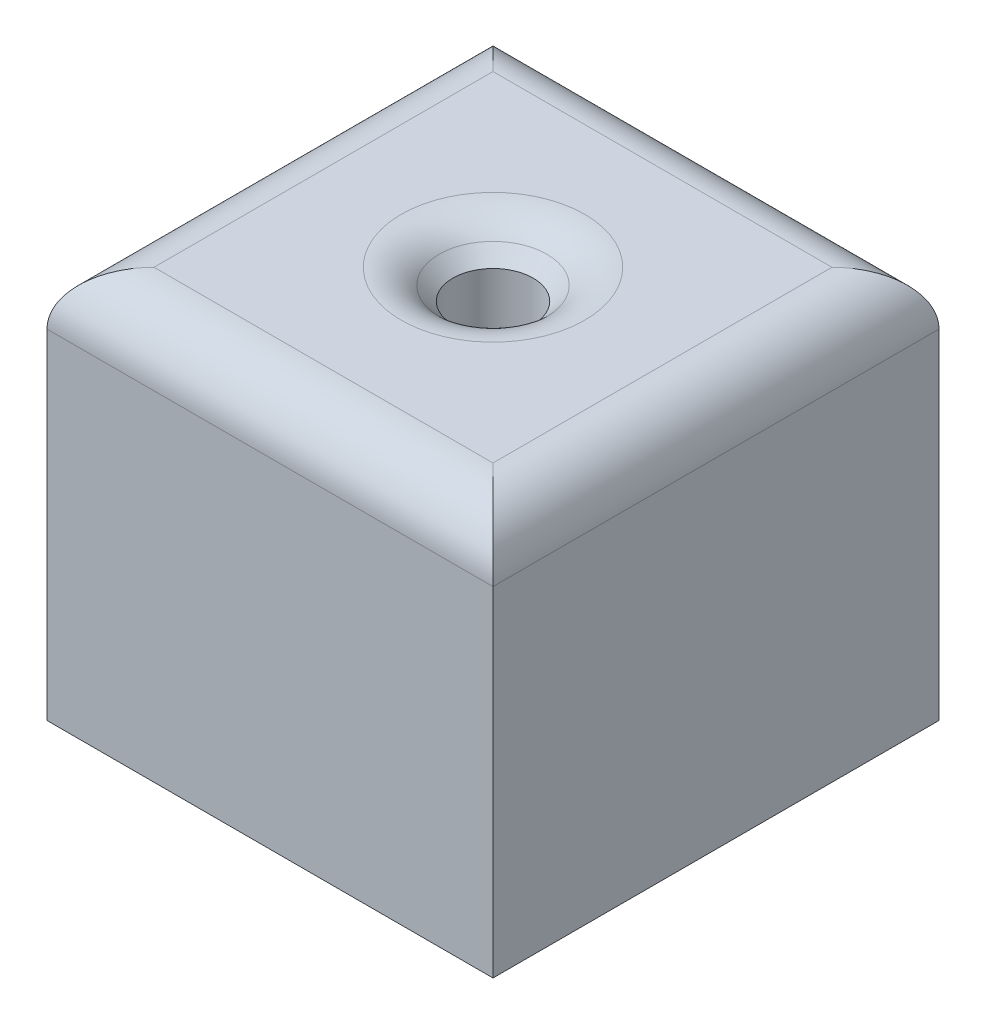
ISO-10303-21;
HEADER;
FILE_DESCRIPTION(('STEP AP214'),'2;1');
FILE_NAME('part.step','',(''),(''),'','','');
FILE_SCHEMA(('AUTOMOTIVE_DESIGN { 1 0 10303 214 1 1 1 1 }'));
ENDSEC;
DATA;
#1=APPLICATION_CONTEXT('core data for automotive mechanical design processes');
#2=APPLICATION_PROTOCOL_DEFINITION('international standard','automotive_design',2000,#1);
#3=PRODUCT_CONTEXT('',#1,'mechanical');
#4=PRODUCT('Part','Part','',(#3));
#5=PRODUCT_RELATED_PRODUCT_CATEGORY('part','',(#4));
#6=PRODUCT_DEFINITION_FORMATION('','',#4);
#7=PRODUCT_DEFINITION_CONTEXT('part definition',#1,'design');
#8=PRODUCT_DEFINITION('design','',#6,#7);
#9=PRODUCT_DEFINITION_SHAPE('','',#8);
#10=(LENGTH_UNIT() NAMED_UNIT(*) SI_UNIT(.MILLI.,.METRE.));
#11=(NAMED_UNIT(*) PLANE_ANGLE_UNIT() SI_UNIT($,.RADIAN.));
#12=(NAMED_UNIT(*) SI_UNIT($,.STERADIAN.) SOLID_ANGLE_UNIT());
#13=UNCERTAINTY_MEASURE_WITH_UNIT(LENGTH_MEASURE(1.E-05),#10,'distance_accuracy_value','');
#14=(GEOMETRIC_REPRESENTATION_CONTEXT(3) GLOBAL_UNCERTAINTY_ASSIGNED_CONTEXT((#13)) GLOBAL_UNIT_ASSIGNED_CONTEXT((#10,
#11,#12)) REPRESENTATION_CONTEXT('',''));
#15=CARTESIAN_POINT('',(0.,0.,0.));
#16=DIRECTION('',(0.,0.,1.));
#17=DIRECTION('',(1.,0.,0.));
#18=AXIS2_PLACEMENT_3D('',#15,#16,#17);
#19=CARTESIAN_POINT('',(0.,0.,25.));
#20=DIRECTION('',(1.,0.,0.));
#21=DIRECTION('',(0.,0.,-1.));
#22=AXIS2_PLACEMENT_3D('',#19,#20,#21);
#23=PLANE('',#22);
#24=DIRECTION('',(0.,-1.,0.));
#25=VECTOR('',#24,1.);
#26=CARTESIAN_POINT('',(0.,0.,0.));
#27=LINE('',#26,#25);
#28=CARTESIAN_POINT('',(0.,22.,0.));
#29=VERTEX_POINT('',#28);
#30=CARTESIAN_POINT('',(0.,3.00000000000001,0.));
#31=VERTEX_POINT('',#30);
#32=EDGE_CURVE('E200',#29,#31,#27,.T.);
#33=ORIENTED_EDGE('',*,*,#32,.T.);
#34=DIRECTION('',(0.,0.,1.));
#35=VECTOR('',#34,1.);
#36=CARTESIAN_POINT('',(0.,3.00000000000001,25.));
#37=LINE('',#36,#35);
#38=CARTESIAN_POINT('',(0.,3.00000000000001,25.));
#39=VERTEX_POINT('',#38);
#40=EDGE_CURVE('E170',#31,#39,#37,.T.);
#41=ORIENTED_EDGE('',*,*,#40,.T.);
#42=DIRECTION('',(0.,-1.,0.));
#43=VECTOR('',#42,1.);
#44=CARTESIAN_POINT('',(0.,0.,25.));
#45=LINE('',#44,#43);
#46=CARTESIAN_POINT('',(0.,22.,25.));
#47=VERTEX_POINT('',#46);
#48=EDGE_CURVE('E378',#47,#39,#45,.T.);
#49=ORIENTED_EDGE('',*,*,#48,.F.);
#50=DIRECTION('',(0.,0.,-1.));
#51=VECTOR('',#50,1.);
#52=CARTESIAN_POINT('',(0.,22.,25.));
#53=LINE('',#52,#51);
#54=EDGE_CURVE('E144',#47,#29,#53,.T.);
#55=ORIENTED_EDGE('',*,*,#54,.T.);
#56=EDGE_LOOP('',(#33,#41,#49,#55));
#57=FACE_BOUND('',#56,.T.);
#58=ADVANCED_FACE('F40',(#57),#23,.F.);
#59=CARTESIAN_POINT('',(0.,0.,25.));
#60=DIRECTION('',(0.,1.,0.));
#61=DIRECTION('',(0.,0.,1.));
#62=AXIS2_PLACEMENT_3D('',#59,#60,#61);
#63=PLANE('',#62);
#64=DIRECTION('',(-1.,0.,0.));
#65=VECTOR('',#64,1.);
#66=CARTESIAN_POINT('',(0.,0.,22.));
#67=LINE('',#66,#65);
#68=CARTESIAN_POINT('',(22.,0.,22.));
#69=VERTEX_POINT('',#68);
#70=CARTESIAN_POINT('',(3.00000000000001,0.,22.));
#71=VERTEX_POINT('',#70);
#72=EDGE_CURVE('E165',#69,#71,#67,.T.);
#73=ORIENTED_EDGE('',*,*,#72,.T.);
#74=DIRECTION('',(0.,0.,-1.));
#75=VECTOR('',#74,1.);
#76=CARTESIAN_POINT('',(3.00000000000001,0.,25.));
#77=LINE('',#76,#75);
#78=CARTESIAN_POINT('',(3.00000000000001,0.,3.00000000000001));
#79=VERTEX_POINT('',#78);
#80=EDGE_CURVE('E167',#71,#79,#77,.T.);
#81=ORIENTED_EDGE('',*,*,#80,.T.);
#82=DIRECTION('',(1.,0.,0.));
#83=VECTOR('',#82,1.);
#84=CARTESIAN_POINT('',(25.,0.,3.00000000000001));
#85=LINE('',#84,#83);
#86=CARTESIAN_POINT('',(22.,0.,3.00000000000001));
#87=VERTEX_POINT('',#86);
#88=EDGE_CURVE('E161',#79,#87,#85,.T.);
#89=ORIENTED_EDGE('',*,*,#88,.T.);
#90=DIRECTION('',(0.,0.,1.));
#91=VECTOR('',#90,1.);
#92=CARTESIAN_POINT('',(22.,0.,25.));
#93=LINE('',#92,#91);
#94=EDGE_CURVE('E163',#87,#69,#93,.T.);
#95=ORIENTED_EDGE('',*,*,#94,.T.);
#96=EDGE_LOOP('',(#73,#81,#89,#95));
#97=FACE_BOUND('',#96,.T.);
#98=CARTESIAN_POINT('',(12.5,0.,12.5));
#99=DIRECTION('',(0.,1.,0.));
#100=DIRECTION('',(0.,0.,1.));
#101=AXIS2_PLACEMENT_3D('',#98,#99,#100);
#102=CIRCLE('',#101,5.25000000000001);
#103=CARTESIAN_POINT('',(12.5,0.,17.75));
#104=VERTEX_POINT('',#103);
#105=EDGE_CURVE('E151',#104,#104,#102,.T.);
#106=ORIENTED_EDGE('',*,*,#105,.T.);
#107=EDGE_LOOP('',(#106));
#108=FACE_BOUND('',#107,.T.);
#109=ADVANCED_FACE('F211',(#97,#108),#63,.F.);
#110=CARTESIAN_POINT('',(25.,0.,25.));
#111=DIRECTION('',(-1.,0.,0.));
#112=DIRECTION('',(0.,0.,1.));
#113=AXIS2_PLACEMENT_3D('',#110,#111,#112);
#114=PLANE('',#113);
#115=DIRECTION('',(0.,1.,0.));
#116=VECTOR('',#115,1.);
#117=CARTESIAN_POINT('',(25.,0.,25.));
#118=LINE('',#117,#116);
#119=CARTESIAN_POINT('',(25.,3.00000000000001,25.));
#120=VERTEX_POINT('',#119);
#121=CARTESIAN_POINT('',(25.,22.,25.));
#122=VERTEX_POINT('',#121);
#123=EDGE_CURVE('E377',#120,#122,#118,.T.);
#124=ORIENTED_EDGE('',*,*,#123,.F.);
#125=DIRECTION('',(0.,0.,-1.));
#126=VECTOR('',#125,1.);
#127=CARTESIAN_POINT('',(25.,3.00000000000001,25.));
#128=LINE('',#127,#126);
#129=CARTESIAN_POINT('',(25.,3.00000000000001,0.));
#130=VERTEX_POINT('',#129);
#131=EDGE_CURVE('E58',#120,#130,#128,.T.);
#132=ORIENTED_EDGE('',*,*,#131,.T.);
#133=DIRECTION('',(0.,1.,0.));
#134=VECTOR('',#133,1.);
#135=CARTESIAN_POINT('',(25.,0.,0.));
#136=LINE('',#135,#134);
#137=CARTESIAN_POINT('',(25.,22.,0.));
#138=VERTEX_POINT('',#137);
#139=EDGE_CURVE('E201',#130,#138,#136,.T.);
#140=ORIENTED_EDGE('',*,*,#139,.T.);
#141=DIRECTION('',(0.,0.,-1.));
#142=VECTOR('',#141,1.);
#143=CARTESIAN_POINT('',(25.,22.,25.));
#144=LINE('',#143,#142);
#145=EDGE_CURVE('E117',#138,#122,#144,.F.);
#146=ORIENTED_EDGE('',*,*,#145,.T.);
#147=EDGE_LOOP('',(#124,#132,#140,#146));
#148=FACE_BOUND('',#147,.T.);
#149=ADVANCED_FACE('F214',(#148),#114,.F.);
#150=CARTESIAN_POINT('',(0.,25.,25.));
#151=DIRECTION('',(0.,-1.,0.));
#152=DIRECTION('',(0.,0.,-1.));
#153=AXIS2_PLACEMENT_3D('',#150,#151,#152);
#154=PLANE('',#153);
#155=DIRECTION('',(-1.,0.,0.));
#156=VECTOR('',#155,1.);
#157=CARTESIAN_POINT('',(0.,25.,22.));
#158=LINE('',#157,#156);
#159=CARTESIAN_POINT('',(3.,25.,22.));
#160=VERTEX_POINT('',#159);
#161=CARTESIAN_POINT('',(22.,25.,22.));
#162=VERTEX_POINT('',#161);
#163=EDGE_CURVE('E135',#160,#162,#158,.F.);
#164=ORIENTED_EDGE('',*,*,#163,.T.);
#165=DIRECTION('',(0.,0.,-1.));
#166=VECTOR('',#165,1.);
#167=CARTESIAN_POINT('',(22.,25.,25.));
#168=LINE('',#167,#166);
#169=CARTESIAN_POINT('',(22.,25.,3.));
#170=VERTEX_POINT('',#169);
#171=EDGE_CURVE('E115',#162,#170,#168,.T.);
#172=ORIENTED_EDGE('',*,*,#171,.T.);
#173=DIRECTION('',(-1.,0.,0.));
#174=VECTOR('',#173,1.);
#175=CARTESIAN_POINT('',(0.,25.,3.));
#176=LINE('',#175,#174);
#177=CARTESIAN_POINT('',(3.,25.,3.));
#178=VERTEX_POINT('',#177);
#179=EDGE_CURVE('E123',#170,#178,#176,.T.);
#180=ORIENTED_EDGE('',*,*,#179,.T.);
#181=DIRECTION('',(0.,0.,-1.));
#182=VECTOR('',#181,1.);
#183=CARTESIAN_POINT('',(3.,25.,25.));
#184=LINE('',#183,#182);
#185=EDGE_CURVE('E129',#178,#160,#184,.F.);
#186=ORIENTED_EDGE('',*,*,#185,.T.);
#187=EDGE_LOOP('',(#164,#172,#180,#186));
#188=FACE_BOUND('',#187,.T.);
#189=CARTESIAN_POINT('',(12.5,25.,12.5));
#190=DIRECTION('',(0.,-1.,0.));
#191=DIRECTION('',(0.,0.,-1.));
#192=AXIS2_PLACEMENT_3D('',#189,#190,#191);
#193=CIRCLE('',#192,5.1426406871193);
#194=CARTESIAN_POINT('',(12.5,25.,7.3573593128807));
#195=VERTEX_POINT('',#194);
#196=EDGE_CURVE('E130',#195,#195,#193,.T.);
#197=ORIENTED_EDGE('',*,*,#196,.T.);
#198=EDGE_LOOP('',(#197));
#199=FACE_BOUND('',#198,.T.);
#200=ADVANCED_FACE('F132',(#188,#199),#154,.F.);
#201=CARTESIAN_POINT('',(0.,0.,25.));
#202=DIRECTION('',(0.,0.,-1.));
#203=DIRECTION('',(-1.,0.,0.));
#204=AXIS2_PLACEMENT_3D('',#201,#202,#203);
#205=PLANE('',#204);
#206=ORIENTED_EDGE('',*,*,#48,.T.);
#207=DIRECTION('',(1.,0.,0.));
#208=VECTOR('',#207,1.);
#209=CARTESIAN_POINT('',(0.,3.00000000000001,25.));
#210=LINE('',#209,#208);
#211=EDGE_CURVE('E66',#39,#120,#210,.T.);
#212=ORIENTED_EDGE('',*,*,#211,.T.);
#213=ORIENTED_EDGE('',*,*,#123,.T.);
#214=DIRECTION('',(-1.,0.,0.));
#215=VECTOR('',#214,1.);
#216=CARTESIAN_POINT('',(0.,22.,25.));
#217=LINE('',#216,#215);
#218=EDGE_CURVE('E138',#122,#47,#217,.T.);
#219=ORIENTED_EDGE('',*,*,#218,.T.);
#220=EDGE_LOOP('',(#206,#212,#213,#219));
#221=FACE_BOUND('',#220,.T.);
#222=ADVANCED_FACE('F341',(#221),#205,.F.);
#223=CARTESIAN_POINT('',(0.,0.,0.));
#224=DIRECTION('',(0.,0.,-1.));
#225=DIRECTION('',(-1.,0.,0.));
#226=AXIS2_PLACEMENT_3D('',#223,#224,#225);
#227=PLANE('',#226);
#228=ORIENTED_EDGE('',*,*,#139,.F.);
#229=DIRECTION('',(-1.,0.,0.));
#230=VECTOR('',#229,1.);
#231=CARTESIAN_POINT('',(0.,3.00000000000001,0.));
#232=LINE('',#231,#230);
#233=EDGE_CURVE('E50',#130,#31,#232,.T.);
#234=ORIENTED_EDGE('',*,*,#233,.T.);
#235=ORIENTED_EDGE('',*,*,#32,.F.);
#236=DIRECTION('',(-1.,0.,0.));
#237=VECTOR('',#236,1.);
#238=CARTESIAN_POINT('',(25.,22.,0.));
#239=LINE('',#238,#237);
#240=EDGE_CURVE('E146',#29,#138,#239,.F.);
#241=ORIENTED_EDGE('',*,*,#240,.T.);
#242=EDGE_LOOP('',(#228,#234,#235,#241));
#243=FACE_BOUND('',#242,.T.);
#244=ADVANCED_FACE('F199',(#243),#227,.T.);
#245=CARTESIAN_POINT('',(12.5,25.,12.5));
#246=DIRECTION('',(0.,1.,0.));
#247=DIRECTION('',(0.,0.,1.));
#248=AXIS2_PLACEMENT_3D('',#245,#246,#247);
#249=CYLINDRICAL_SURFACE('',#248,2.25);
#250=CARTESIAN_POINT('',(12.5,3.00000000000001,12.5));
#251=DIRECTION('',(0.,1.,0.));
#252=DIRECTION('',(0.,0.,1.));
#253=AXIS2_PLACEMENT_3D('',#250,#251,#252);
#254=CIRCLE('',#253,2.25);
#255=CARTESIAN_POINT('',(12.5,3.00000000000001,14.75));
#256=VERTEX_POINT('',#255);
#257=EDGE_CURVE('E11',#256,#256,#254,.F.);
#258=ORIENTED_EDGE('',*,*,#257,.T.);
#259=EDGE_LOOP('',(#258));
#260=FACE_BOUND('',#259,.T.);
#261=CARTESIAN_POINT('',(12.5,23.35,12.5));
#262=DIRECTION('',(0.,1.,0.));
#263=DIRECTION('',(0.,0.,1.));
#264=AXIS2_PLACEMENT_3D('',#261,#262,#263);
#265=CIRCLE('',#264,2.25);
#266=CARTESIAN_POINT('',(12.5,23.35,14.75));
#267=VERTEX_POINT('',#266);
#268=EDGE_CURVE('E158',#267,#267,#265,.T.);
#269=ORIENTED_EDGE('',*,*,#268,.T.);
#270=EDGE_LOOP('',(#269));
#271=FACE_BOUND('',#270,.T.);
#272=ADVANCED_FACE('F325',(#260,#271),#249,.F.);
#273=CARTESIAN_POINT('',(12.5,25.,12.5));
#274=DIRECTION('',(0.,1.,0.));
#275=DIRECTION('',(0.,0.,1.));
#276=AXIS2_PLACEMENT_3D('',#273,#274,#275);
#277=CONICAL_SURFACE('',#276,3.9,0.785398163397442);
#278=CARTESIAN_POINT('',(12.5,24.1213203435596,12.5));
#279=DIRECTION('',(0.,-1.,0.));
#280=DIRECTION('',(0.,0.,-1.));
#281=AXIS2_PLACEMENT_3D('',#278,#279,#280);
#282=CIRCLE('',#281,3.02132034355964);
#283=CARTESIAN_POINT('',(12.5,24.1213203435596,9.47867965644036));
#284=VERTEX_POINT('',#283);
#285=EDGE_CURVE('E149',#284,#284,#282,.F.);
#286=ORIENTED_EDGE('',*,*,#285,.T.);
#287=EDGE_LOOP('',(#286));
#288=FACE_BOUND('',#287,.T.);
#289=ORIENTED_EDGE('',*,*,#268,.F.);
#290=EDGE_LOOP('',(#289));
#291=FACE_BOUND('',#290,.T.);
#292=ADVANCED_FACE('F244',(#288,#291),#277,.F.);
#293=CARTESIAN_POINT('',(3.,22.,25.));
#294=DIRECTION('',(0.,0.,-1.));
#295=DIRECTION('',(-1.,0.,0.));
#296=AXIS2_PLACEMENT_3D('',#293,#294,#295);
#297=CYLINDRICAL_SURFACE('',#296,3.);
#298=CARTESIAN_POINT('',(3.,22.,3.));
#299=DIRECTION('',(0.707106781186547,0.,-0.707106781186547));
#300=DIRECTION('',(0.707106781186547,0.,0.707106781186547));
#301=AXIS2_PLACEMENT_3D('',#298,#299,#300);
#302=ELLIPSE('',#301,4.24264068711928,3.);
#303=EDGE_CURVE('E126',#29,#178,#302,.T.);
#304=ORIENTED_EDGE('',*,*,#303,.F.);
#305=ORIENTED_EDGE('',*,*,#54,.F.);
#306=CARTESIAN_POINT('',(3.,22.,22.));
#307=DIRECTION('',(-0.707106781186547,0.,-0.707106781186547));
#308=DIRECTION('',(0.707106781186547,0.,-0.707106781186547));
#309=AXIS2_PLACEMENT_3D('',#306,#307,#308);
#310=ELLIPSE('',#309,4.24264068711928,3.);
#311=EDGE_CURVE('E155',#160,#47,#310,.F.);
#312=ORIENTED_EDGE('',*,*,#311,.F.);
#313=ORIENTED_EDGE('',*,*,#185,.F.);
#314=EDGE_LOOP('',(#304,#305,#312,#313));
#315=FACE_BOUND('',#314,.T.);
#316=ADVANCED_FACE('F240',(#315),#297,.T.);
#317=CARTESIAN_POINT('',(0.,22.,22.));
#318=DIRECTION('',(-1.,0.,0.));
#319=DIRECTION('',(0.,0.,1.));
#320=AXIS2_PLACEMENT_3D('',#317,#318,#319);
#321=CYLINDRICAL_SURFACE('',#320,3.);
#322=ORIENTED_EDGE('',*,*,#311,.T.);
#323=ORIENTED_EDGE('',*,*,#218,.F.);
#324=CARTESIAN_POINT('',(22.,22.,22.));
#325=DIRECTION('',(-0.707106781186547,0.,0.707106781186547));
#326=DIRECTION('',(-0.707106781186547,0.,-0.707106781186547));
#327=AXIS2_PLACEMENT_3D('',#324,#325,#326);
#328=ELLIPSE('',#327,4.24264068711928,3.);
#329=EDGE_CURVE('E120',#162,#122,#328,.F.);
#330=ORIENTED_EDGE('',*,*,#329,.F.);
#331=ORIENTED_EDGE('',*,*,#163,.F.);
#332=EDGE_LOOP('',(#322,#323,#330,#331));
#333=FACE_BOUND('',#332,.T.);
#334=ADVANCED_FACE('F237',(#333),#321,.T.);
#335=CARTESIAN_POINT('',(0.,22.,3.));
#336=DIRECTION('',(1.,0.,0.));
#337=DIRECTION('',(0.,0.,-1.));
#338=AXIS2_PLACEMENT_3D('',#335,#336,#337);
#339=CYLINDRICAL_SURFACE('',#338,3.);
#340=ORIENTED_EDGE('',*,*,#303,.T.);
#341=ORIENTED_EDGE('',*,*,#179,.F.);
#342=CARTESIAN_POINT('',(22.,22.,3.));
#343=DIRECTION('',(0.707106781186547,0.,0.707106781186547));
#344=DIRECTION('',(0.707106781186547,0.,-0.707106781186547));
#345=AXIS2_PLACEMENT_3D('',#342,#343,#344);
#346=ELLIPSE('',#345,4.24264068711928,3.);
#347=EDGE_CURVE('E110',#138,#170,#346,.T.);
#348=ORIENTED_EDGE('',*,*,#347,.F.);
#349=ORIENTED_EDGE('',*,*,#240,.F.);
#350=EDGE_LOOP('',(#340,#341,#348,#349));
#351=FACE_BOUND('',#350,.T.);
#352=ADVANCED_FACE('F124',(#351),#339,.T.);
#353=CARTESIAN_POINT('',(22.,22.,25.));
#354=DIRECTION('',(0.,0.,-1.));
#355=DIRECTION('',(-1.,0.,0.));
#356=AXIS2_PLACEMENT_3D('',#353,#354,#355);
#357=CYLINDRICAL_SURFACE('',#356,3.);
#358=ORIENTED_EDGE('',*,*,#329,.T.);
#359=ORIENTED_EDGE('',*,*,#145,.F.);
#360=ORIENTED_EDGE('',*,*,#347,.T.);
#361=ORIENTED_EDGE('',*,*,#171,.F.);
#362=EDGE_LOOP('',(#358,#359,#360,#361));
#363=FACE_BOUND('',#362,.T.);
#364=ADVANCED_FACE('F113',(#363),#357,.T.);
#365=CARTESIAN_POINT('',(12.5,22.,12.5));
#366=DIRECTION('',(0.,-1.,0.));
#367=DIRECTION('',(0.,0.,-1.));
#368=AXIS2_PLACEMENT_3D('',#365,#366,#367);
#369=TOROIDAL_SURFACE('',#368,5.1426406871193,3.);
#370=ORIENTED_EDGE('',*,*,#196,.F.);
#371=EDGE_LOOP('',(#370));
#372=FACE_BOUND('',#371,.T.);
#373=ORIENTED_EDGE('',*,*,#285,.F.);
#374=EDGE_LOOP('',(#373));
#375=FACE_BOUND('',#374,.T.);
#376=ADVANCED_FACE('F234',(#372,#375),#369,.T.);
#377=CARTESIAN_POINT('',(25.,3.00000000000001,25.));
#378=DIRECTION('',(-0.707106781186547,0.707106781186547,0.));
#379=DIRECTION('',(0.,0.,-1.));
#380=AXIS2_PLACEMENT_3D('',#377,#378,#379);
#381=PLANE('',#380);
#382=DIRECTION('',(0.577350269189626,0.577350269189626,-0.577350269189626));
#383=VECTOR('',#382,1.);
#384=CARTESIAN_POINT('',(14.6666666666667,-7.33333333333333,10.3333333333333));
#385=LINE('',#384,#383);
#386=EDGE_CURVE('E179',#130,#87,#385,.F.);
#387=ORIENTED_EDGE('',*,*,#386,.F.);
#388=ORIENTED_EDGE('',*,*,#131,.F.);
#389=DIRECTION('',(-0.577350269189626,-0.577350269189626,-0.577350269189626));
#390=VECTOR('',#389,1.);
#391=CARTESIAN_POINT('',(25.,3.00000000000001,25.));
#392=LINE('',#391,#390);
#393=EDGE_CURVE('E45',#69,#120,#392,.F.);
#394=ORIENTED_EDGE('',*,*,#393,.F.);
#395=ORIENTED_EDGE('',*,*,#94,.F.);
#396=EDGE_LOOP('',(#387,#388,#394,#395));
#397=FACE_BOUND('',#396,.T.);
#398=ADVANCED_FACE('F193',(#397),#381,.F.);
#399=CARTESIAN_POINT('',(0.,3.00000000000001,25.));
#400=DIRECTION('',(0.,0.707106781186547,-0.707106781186547));
#401=DIRECTION('',(1.,0.,0.));
#402=AXIS2_PLACEMENT_3D('',#399,#400,#401);
#403=PLANE('',#402);
#404=ORIENTED_EDGE('',*,*,#393,.T.);
#405=ORIENTED_EDGE('',*,*,#211,.F.);
#406=DIRECTION('',(0.577350269189626,-0.577350269189626,-0.577350269189626));
#407=VECTOR('',#406,1.);
#408=CARTESIAN_POINT('',(0.,3.00000000000001,25.));
#409=LINE('',#408,#407);
#410=EDGE_CURVE('E178',#71,#39,#409,.F.);
#411=ORIENTED_EDGE('',*,*,#410,.F.);
#412=ORIENTED_EDGE('',*,*,#72,.F.);
#413=EDGE_LOOP('',(#404,#405,#411,#412));
#414=FACE_BOUND('',#413,.T.);
#415=ADVANCED_FACE('F189',(#414),#403,.F.);
#416=CARTESIAN_POINT('',(0.,0.,3.00000000000001));
#417=DIRECTION('',(0.,-0.707106781186547,-0.707106781186547));
#418=DIRECTION('',(-1.,0.,0.));
#419=AXIS2_PLACEMENT_3D('',#416,#417,#418);
#420=PLANE('',#419);
#421=ORIENTED_EDGE('',*,*,#386,.T.);
#422=ORIENTED_EDGE('',*,*,#88,.F.);
#423=DIRECTION('',(0.577350269189626,-0.577350269189626,0.577350269189626));
#424=VECTOR('',#423,1.);
#425=CARTESIAN_POINT('',(2.00000000000001,1.,2.00000000000001));
#426=LINE('',#425,#424);
#427=EDGE_CURVE('E176',#31,#79,#426,.T.);
#428=ORIENTED_EDGE('',*,*,#427,.F.);
#429=ORIENTED_EDGE('',*,*,#233,.F.);
#430=EDGE_LOOP('',(#421,#422,#428,#429));
#431=FACE_BOUND('',#430,.T.);
#432=ADVANCED_FACE('F195',(#431),#420,.T.);
#433=CARTESIAN_POINT('',(3.00000000000001,0.,25.));
#434=DIRECTION('',(0.707106781186547,0.707106781186547,0.));
#435=DIRECTION('',(0.,0.,-1.));
#436=AXIS2_PLACEMENT_3D('',#433,#434,#435);
#437=PLANE('',#436);
#438=ORIENTED_EDGE('',*,*,#410,.T.);
#439=ORIENTED_EDGE('',*,*,#40,.F.);
#440=ORIENTED_EDGE('',*,*,#427,.T.);
#441=ORIENTED_EDGE('',*,*,#80,.F.);
#442=EDGE_LOOP('',(#438,#439,#440,#441));
#443=FACE_BOUND('',#442,.T.);
#444=ADVANCED_FACE('F208',(#443),#437,.F.);
#445=CARTESIAN_POINT('',(12.5,0.,12.5));
#446=DIRECTION('',(0.,-1.,0.));
#447=DIRECTION('',(0.,0.,-1.));
#448=AXIS2_PLACEMENT_3D('',#445,#446,#447);
#449=CONICAL_SURFACE('',#448,5.25000000000001,0.785398163397449);
#450=ORIENTED_EDGE('',*,*,#257,.F.);
#451=EDGE_LOOP('',(#450));
#452=FACE_BOUND('',#451,.T.);
#453=ORIENTED_EDGE('',*,*,#105,.F.);
#454=EDGE_LOOP('',(#453));
#455=FACE_BOUND('',#454,.T.);
#456=ADVANCED_FACE('F43',(#452,#455),#449,.F.);
#457=CLOSED_SHELL('',(#58,#109,#149,#200,#222,#244,#272,#292,#316,#334,#352,#364,#376,#398,#415,
#432,#444,#456));
#458=MANIFOLD_SOLID_BREP('B2',#457);
#459=ADVANCED_BREP_SHAPE_REPRESENTATION('',(#18,#458),#14);
#460=SHAPE_DEFINITION_REPRESENTATION(#9,#459);
ENDSEC;
END-ISO-10303-21;
